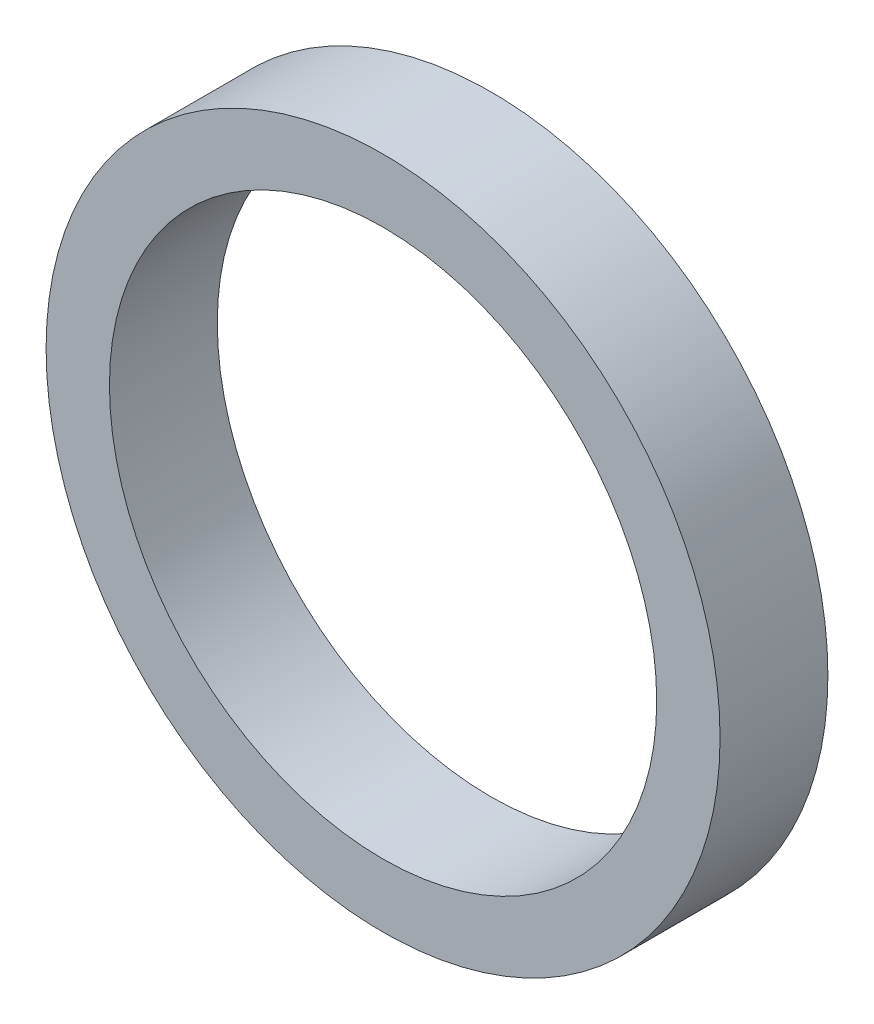
ISO-10303-21;
HEADER;
FILE_DESCRIPTION(('STEP AP214'),'2;1');
FILE_NAME('part.step','',(''),(''),'','','');
FILE_SCHEMA(('AUTOMOTIVE_DESIGN { 1 0 10303 214 1 1 1 1 }'));
ENDSEC;
DATA;
#1=APPLICATION_CONTEXT('core data for automotive mechanical design processes');
#2=APPLICATION_PROTOCOL_DEFINITION('international standard','automotive_design',2000,#1);
#3=PRODUCT_CONTEXT('',#1,'mechanical');
#4=PRODUCT('Part','Part','',(#3));
#5=PRODUCT_RELATED_PRODUCT_CATEGORY('part','',(#4));
#6=PRODUCT_DEFINITION_FORMATION('','',#4);
#7=PRODUCT_DEFINITION_CONTEXT('part definition',#1,'design');
#8=PRODUCT_DEFINITION('design','',#6,#7);
#9=PRODUCT_DEFINITION_SHAPE('','',#8);
#10=(LENGTH_UNIT() NAMED_UNIT(*) SI_UNIT(.MILLI.,.METRE.));
#11=(NAMED_UNIT(*) PLANE_ANGLE_UNIT() SI_UNIT($,.RADIAN.));
#12=(NAMED_UNIT(*) SI_UNIT($,.STERADIAN.) SOLID_ANGLE_UNIT());
#13=UNCERTAINTY_MEASURE_WITH_UNIT(LENGTH_MEASURE(1.E-05),#10,'distance_accuracy_value','');
#14=(GEOMETRIC_REPRESENTATION_CONTEXT(3) GLOBAL_UNCERTAINTY_ASSIGNED_CONTEXT((#13)) GLOBAL_UNIT_ASSIGNED_CONTEXT((#10,
#11,#12)) REPRESENTATION_CONTEXT('',''));
#15=CARTESIAN_POINT('',(0.,0.,0.));
#16=DIRECTION('',(0.,0.,1.));
#17=DIRECTION('',(1.,0.,0.));
#18=AXIS2_PLACEMENT_3D('',#15,#16,#17);
#19=CARTESIAN_POINT('',(0.,0.,4.));
#20=DIRECTION('',(0.,0.,1.));
#21=DIRECTION('',(1.,0.,0.));
#22=AXIS2_PLACEMENT_3D('',#19,#20,#21);
#23=PLANE('',#22);
#24=CARTESIAN_POINT('',(0.,0.,4.));
#25=DIRECTION('',(0.,0.,1.));
#26=DIRECTION('',(1.,0.,0.));
#27=AXIS2_PLACEMENT_3D('',#24,#25,#26);
#28=CIRCLE('',#27,12.5);
#29=CARTESIAN_POINT('',(12.5,0.,4.));
#30=VERTEX_POINT('',#29);
#31=EDGE_CURVE('E10',#30,#30,#28,.T.);
#32=ORIENTED_EDGE('',*,*,#31,.T.);
#33=EDGE_LOOP('',(#32));
#34=FACE_BOUND('',#33,.T.);
#35=CARTESIAN_POINT('',(0.,0.,4.));
#36=DIRECTION('',(0.,0.,1.));
#37=DIRECTION('',(1.,0.,0.));
#38=AXIS2_PLACEMENT_3D('',#35,#36,#37);
#39=CIRCLE('',#38,10.15);
#40=CARTESIAN_POINT('',(10.15,0.,4.));
#41=VERTEX_POINT('',#40);
#42=EDGE_CURVE('E48',#41,#41,#39,.T.);
#43=ORIENTED_EDGE('',*,*,#42,.F.);
#44=EDGE_LOOP('',(#43));
#45=FACE_BOUND('',#44,.T.);
#46=ADVANCED_FACE('F37',(#34,#45),#23,.T.);
#47=CARTESIAN_POINT('',(0.,0.,0.));
#48=DIRECTION('',(0.,0.,1.));
#49=DIRECTION('',(1.,0.,0.));
#50=AXIS2_PLACEMENT_3D('',#47,#48,#49);
#51=PLANE('',#50);
#52=CARTESIAN_POINT('',(0.,0.,0.));
#53=DIRECTION('',(0.,0.,1.));
#54=DIRECTION('',(1.,0.,0.));
#55=AXIS2_PLACEMENT_3D('',#52,#53,#54);
#56=CIRCLE('',#55,12.5);
#57=CARTESIAN_POINT('',(12.5,0.,0.));
#58=VERTEX_POINT('',#57);
#59=EDGE_CURVE('E41',#58,#58,#56,.T.);
#60=ORIENTED_EDGE('',*,*,#59,.F.);
#61=EDGE_LOOP('',(#60));
#62=FACE_BOUND('',#61,.T.);
#63=CARTESIAN_POINT('',(0.,0.,0.));
#64=DIRECTION('',(0.,0.,1.));
#65=DIRECTION('',(1.,0.,0.));
#66=AXIS2_PLACEMENT_3D('',#63,#64,#65);
#67=CIRCLE('',#66,10.15);
#68=CARTESIAN_POINT('',(10.15,0.,0.));
#69=VERTEX_POINT('',#68);
#70=EDGE_CURVE('E50',#69,#69,#67,.T.);
#71=ORIENTED_EDGE('',*,*,#70,.T.);
#72=EDGE_LOOP('',(#71));
#73=FACE_BOUND('',#72,.T.);
#74=ADVANCED_FACE('F60',(#62,#73),#51,.F.);
#75=CARTESIAN_POINT('',(0.,0.,4.));
#76=DIRECTION('',(0.,0.,-1.));
#77=DIRECTION('',(-1.,0.,0.));
#78=AXIS2_PLACEMENT_3D('',#75,#76,#77);
#79=CYLINDRICAL_SURFACE('',#78,12.5);
#80=ORIENTED_EDGE('',*,*,#31,.F.);
#81=EDGE_LOOP('',(#80));
#82=FACE_BOUND('',#81,.T.);
#83=ORIENTED_EDGE('',*,*,#59,.T.);
#84=EDGE_LOOP('',(#83));
#85=FACE_BOUND('',#84,.T.);
#86=ADVANCED_FACE('F39',(#82,#85),#79,.T.);
#87=CARTESIAN_POINT('',(0.,0.,4.));
#88=DIRECTION('',(0.,0.,-1.));
#89=DIRECTION('',(-1.,0.,0.));
#90=AXIS2_PLACEMENT_3D('',#87,#88,#89);
#91=CYLINDRICAL_SURFACE('',#90,10.15);
#92=ORIENTED_EDGE('',*,*,#42,.T.);
#93=EDGE_LOOP('',(#92));
#94=FACE_BOUND('',#93,.T.);
#95=ORIENTED_EDGE('',*,*,#70,.F.);
#96=EDGE_LOOP('',(#95));
#97=FACE_BOUND('',#96,.T.);
#98=ADVANCED_FACE('F56',(#94,#97),#91,.F.);
#99=CLOSED_SHELL('',(#46,#74,#86,#98));
#100=MANIFOLD_SOLID_BREP('B2',#99);
#101=ADVANCED_BREP_SHAPE_REPRESENTATION('',(#18,#100),#14);
#102=SHAPE_DEFINITION_REPRESENTATION(#9,#101);
ENDSEC;
END-ISO-10303-21;
